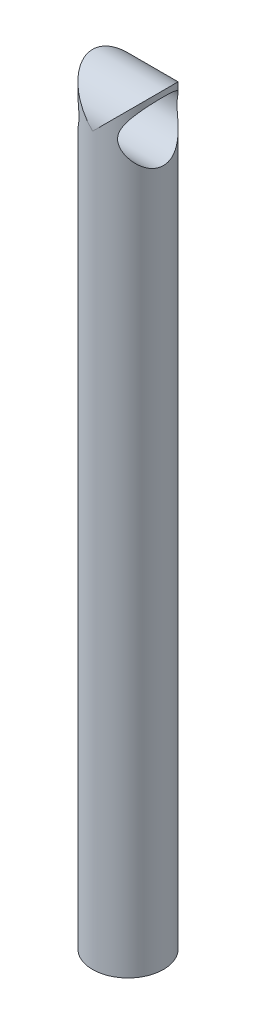
ISO-10303-21;
HEADER;
FILE_DESCRIPTION(('STEP AP214'),'2;1');
FILE_NAME('part.step','',(''),(''),'','','');
FILE_SCHEMA(('AUTOMOTIVE_DESIGN { 1 0 10303 214 1 1 1 1 }'));
ENDSEC;
DATA;
#1=APPLICATION_CONTEXT('core data for automotive mechanical design processes');
#2=APPLICATION_PROTOCOL_DEFINITION('international standard','automotive_design',2000,#1);
#3=PRODUCT_CONTEXT('',#1,'mechanical');
#4=PRODUCT('Part','Part','',(#3));
#5=PRODUCT_RELATED_PRODUCT_CATEGORY('part','',(#4));
#6=PRODUCT_DEFINITION_FORMATION('','',#4);
#7=PRODUCT_DEFINITION_CONTEXT('part definition',#1,'design');
#8=PRODUCT_DEFINITION('design','',#6,#7);
#9=PRODUCT_DEFINITION_SHAPE('','',#8);
#10=(LENGTH_UNIT() NAMED_UNIT(*) SI_UNIT(.MILLI.,.METRE.));
#11=(NAMED_UNIT(*) PLANE_ANGLE_UNIT() SI_UNIT($,.RADIAN.));
#12=(NAMED_UNIT(*) SI_UNIT($,.STERADIAN.) SOLID_ANGLE_UNIT());
#13=UNCERTAINTY_MEASURE_WITH_UNIT(LENGTH_MEASURE(1.E-05),#10,'distance_accuracy_value','');
#14=(GEOMETRIC_REPRESENTATION_CONTEXT(3) GLOBAL_UNCERTAINTY_ASSIGNED_CONTEXT((#13)) GLOBAL_UNIT_ASSIGNED_CONTEXT((#10,
#11,#12)) REPRESENTATION_CONTEXT('',''));
#15=CARTESIAN_POINT('',(0.,0.,0.));
#16=DIRECTION('',(0.,0.,1.));
#17=DIRECTION('',(1.,0.,0.));
#18=AXIS2_PLACEMENT_3D('',#15,#16,#17);
#19=CARTESIAN_POINT('',(0.,101.6,0.));
#20=DIRECTION('',(0.,-1.,0.));
#21=DIRECTION('',(0.,0.,-1.));
#22=AXIS2_PLACEMENT_3D('',#19,#20,#21);
#23=CYLINDRICAL_SURFACE('',#22,4.73075);
#24=CARTESIAN_POINT('',(-4.73075,92.9005,0.));
#25=CARTESIAN_POINT('',(-4.73074913033436,92.9005008863845,-0.0939806417282282));
#26=CARTESIAN_POINT('',(-4.72794287813442,92.9038447836133,-0.187979869598763));
#27=CARTESIAN_POINT('',(-4.71678018112427,92.9171608106088,-0.375215117248981));
#28=CARTESIAN_POINT('',(-4.70842059153266,92.9271366959849,-0.468450674269981));
#29=CARTESIAN_POINT('',(-4.68632011533821,92.9535597342124,-0.653524965714133));
#30=CARTESIAN_POINT('',(-4.67256978813208,92.9700182400796,-0.745360954400749));
#31=CARTESIAN_POINT('',(-4.63999379819718,93.00911551341,-0.9268058187853));
#32=CARTESIAN_POINT('',(-4.62116580027675,93.0317571245084,-1.01641364900489));
#33=CARTESIAN_POINT('',(-4.55792209872708,93.1080724581659,-1.27971882696562));
#34=CARTESIAN_POINT('',(-4.50656377584212,93.170352577718,-1.44935381563049));
#35=CARTESIAN_POINT('',(-4.38888344348945,93.3146720327283,-1.774153749356));
#36=CARTESIAN_POINT('',(-4.32256161465289,93.3967111296679,-1.92931886905693));
#37=CARTESIAN_POINT('',(-4.2013486954662,93.5490520829122,-2.17745257522755));
#38=CARTESIAN_POINT('',(-4.14941093080523,93.6149460844791,-2.27464811733148));
#39=CARTESIAN_POINT('',(-4.04142375060201,93.7538053507348,-2.46140609177837));
#40=CARTESIAN_POINT('',(-3.98537423189192,93.8267707928677,-2.55096833247254));
#41=CARTESIAN_POINT('',(-3.87015530380712,93.9793377553306,-2.72261091394219));
#42=CARTESIAN_POINT('',(-3.81097749434243,94.0589575151216,-2.80466930749562));
#43=CARTESIAN_POINT('',(-3.6908289015994,94.2241760261593,-2.96099483919658));
#44=CARTESIAN_POINT('',(-3.62985877660445,94.3097725977373,-3.03526479322461));
#45=CARTESIAN_POINT('',(-3.50617172894973,94.4883977517907,-3.17738793231428));
#46=CARTESIAN_POINT('',(-3.44344359142083,94.5815363765623,-3.24509297328402));
#47=CARTESIAN_POINT('',(-3.31883360890746,94.7737779172069,-3.3724284145958));
#48=CARTESIAN_POINT('',(-3.25695205379881,94.8728828162008,-3.43205610847668));
#49=CARTESIAN_POINT('',(-3.13600690927128,95.0769698915066,-3.54290324698783));
#50=CARTESIAN_POINT('',(-3.07693707954222,95.1819378096681,-3.59414199255155));
#51=CARTESIAN_POINT('',(-2.96386452900353,95.3982069106626,-3.68793862938186));
#52=CARTESIAN_POINT('',(-2.90985754779597,95.5095026395818,-3.73050385549113));
#53=CARTESIAN_POINT('',(-2.80577142518534,95.7485911582924,-3.80949580613738));
#54=CARTESIAN_POINT('',(-2.75641174940706,95.8769829246336,-3.8450979202401));
#55=CARTESIAN_POINT('',(-2.67272699039781,96.1412055145986,-3.9037364871325));
#56=CARTESIAN_POINT('',(-2.63836627395542,96.2770178350208,-3.9268027538172));
#57=CARTESIAN_POINT('',(-2.59002883217623,96.5559224510817,-3.95887215618646));
#58=CARTESIAN_POINT('',(-2.57631901400834,96.6990857436938,-3.96769125485689));
#59=CARTESIAN_POINT('',(-2.5733367994655,96.9857579299077,-3.96962738878156));
#60=CARTESIAN_POINT('',(-2.5840594258715,97.129266747172,-3.96274762210637));
#61=CARTESIAN_POINT('',(-2.62885959609538,97.4207481479719,-3.93316601533195));
#62=CARTESIAN_POINT('',(-2.66447356738763,97.5683621426431,-3.90942153128765));
#63=CARTESIAN_POINT('',(-2.75354785467926,97.8550358684024,-3.84719021312922));
#64=CARTESIAN_POINT('',(-2.80706851390373,97.9940647665764,-3.80865346544434));
#65=CARTESIAN_POINT('',(-2.9134262021807,98.2361348912517,-3.72766716569107));
#66=CARTESIAN_POINT('',(-2.96429996373065,98.3408508137363,-3.68750351966326));
#67=CARTESIAN_POINT('',(-3.07057911624298,98.5446619760648,-3.59948603443905));
#68=CARTESIAN_POINT('',(-3.12598725167142,98.6437537494822,-3.55162752070451));
#69=CARTESIAN_POINT('',(-3.2393838091879,98.8366538837284,-3.44851773025266));
#70=CARTESIAN_POINT('',(-3.29737567668693,98.9304547873182,-3.39325637217126));
#71=CARTESIAN_POINT('',(-3.41431357470089,99.1127747752907,-3.27556733556311));
#72=CARTESIAN_POINT('',(-3.4732594053006,99.2012949485545,-3.21314114223423));
#73=CARTESIAN_POINT('',(-3.59426079087802,99.3780498807517,-3.07734109522907));
#74=CARTESIAN_POINT('',(-3.65629870418733,99.4659711198334,-3.003542566101));
#75=CARTESIAN_POINT('',(-3.77874265976216,99.6357148811644,-2.8479651173399));
#76=CARTESIAN_POINT('',(-3.83914846210554,99.7175365098405,-2.76618503247123));
#77=CARTESIAN_POINT('',(-3.95699405009166,99.8744891030321,-2.594798483188));
#78=CARTESIAN_POINT('',(-4.01443937637671,99.9496327719546,-2.50520755122262));
#79=CARTESIAN_POINT('',(-4.12527953324713,100.092750787235,-2.31816868573206));
#80=CARTESIAN_POINT('',(-4.17867429167995,100.160725005893,-2.22072061231177));
#81=CARTESIAN_POINT('',(-4.30753363635934,100.323151122668,-1.96352295445991));
#82=CARTESIAN_POINT('',(-4.3794532947026,100.412221153464,-1.7984173002155));
#83=CARTESIAN_POINT('',(-4.47449846475505,100.528841994461,-1.53863747015299));
#84=CARTESIAN_POINT('',(-4.50404764026048,100.564892656867,-1.44999732716498));
#85=CARTESIAN_POINT('',(-4.55833506419148,100.63086583935,-1.26904698713778));
#86=CARTESIAN_POINT('',(-4.58307536892576,100.660790979038,-1.17673837918947));
#87=CARTESIAN_POINT('',(-4.62741723523714,100.714272254379,-0.988165543245692));
#88=CARTESIAN_POINT('',(-4.64697192556483,100.737770353939,-0.891873765464703));
#89=CARTESIAN_POINT('',(-4.68018702109579,100.777606783827,-0.696864173858378));
#90=CARTESIAN_POINT('',(-4.69385042606728,100.79394875803,-0.598147621827935));
#91=CARTESIAN_POINT('',(-4.71494351766432,100.819151388563,-0.399138093000496));
#92=CARTESIAN_POINT('',(-4.72237552559209,100.828014830782,-0.298845717420976));
#93=CARTESIAN_POINT('',(-4.7308144997927,100.838077846444,-0.0976143618227979));
#94=CARTESIAN_POINT('',(-4.73182225893961,100.839278365636,0.00332453686333426));
#95=CARTESIAN_POINT('',(-4.7276708100602,100.834329272163,0.191967540956982));
#96=CARTESIAN_POINT('',(-4.72328331316591,100.829099436954,0.279714365388668));
#97=CARTESIAN_POINT('',(-4.70970102070865,100.812888238879,0.454307988989981));
#98=CARTESIAN_POINT('',(-4.70050473338932,100.80190509125,0.541154500338795));
#99=CARTESIAN_POINT('',(-4.66594918229937,100.760561551337,0.799348444922782));
#100=CARTESIAN_POINT('',(-4.63361887820536,100.721802010521,0.968525440249296));
#101=CARTESIAN_POINT('',(-4.5525997068109,100.623966611222,1.29716896922015));
#102=CARTESIAN_POINT('',(-4.50386021712379,100.564827869381,1.45660362709089));
#103=CARTESIAN_POINT('',(-4.39308397267465,100.428983282284,1.76276997148691));
#104=CARTESIAN_POINT('',(-4.33104198081048,100.35227051744,1.90949662292557));
#105=CARTESIAN_POINT('',(-4.16678719066342,100.1462289265,2.25122341381291));
#106=CARTESIAN_POINT('',(-4.05898522042404,100.00867800941,2.43864439663669));
#107=CARTESIAN_POINT('',(-3.88819250920595,99.7832514491616,2.6967974821068));
#108=CARTESIAN_POINT('',(-3.82962699527536,99.7047589319411,2.77915289368898));
#109=CARTESIAN_POINT('',(-3.71058004040893,99.5417939120569,2.9362001252443));
#110=CARTESIAN_POINT('',(-3.65009931532347,99.4573236294658,3.01089476535769));
#111=CARTESIAN_POINT('',(-3.52730686903073,99.2810848703623,3.15391065314387));
#112=CARTESIAN_POINT('',(-3.46498189838005,99.189211087879,3.22209017252661));
#113=CARTESIAN_POINT('',(-3.34098440123215,98.9995811803161,3.3504896086023));
#114=CARTESIAN_POINT('',(-3.27931208176763,98.901823250778,3.41070706532978));
#115=CARTESIAN_POINT('',(-3.15849385730745,98.7005180108776,3.52288053377794));
#116=CARTESIAN_POINT('',(-3.09934287068374,98.5969834210618,3.57485379905192));
#117=CARTESIAN_POINT('',(-2.98570381331455,98.3836944169856,3.67029555367076));
#118=CARTESIAN_POINT('',(-2.93121218191423,98.2739448607437,3.71377057060839));
#119=CARTESIAN_POINT('',(-2.82443436210786,98.0358412430594,3.79572725671029));
#120=CARTESIAN_POINT('',(-2.77299048501176,97.9067469915138,3.83319500305309));
#121=CARTESIAN_POINT('',(-2.68487401692861,97.6406780129303,3.89543340782833));
#122=CARTESIAN_POINT('',(-2.64816872964845,97.5037215083912,3.9202322049128));
#123=CARTESIAN_POINT('',(-2.60839532413988,97.2930307859034,3.94670989499622));
#124=CARTESIAN_POINT('',(-2.59766387968023,97.2213759058833,3.95376029841831));
#125=CARTESIAN_POINT('',(-2.58207813902328,97.0771699601514,3.96395748445331));
#126=CARTESIAN_POINT('',(-2.57722072619139,97.0046193903348,3.9671063371668));
#127=CARTESIAN_POINT('',(-2.57368313070753,96.8593180193239,3.9694024486088));
#128=CARTESIAN_POINT('',(-2.57500155880934,96.7865672668399,3.96855060728736));
#129=CARTESIAN_POINT('',(-2.58371724676678,96.6416043629612,3.96288069814061));
#130=CARTESIAN_POINT('',(-2.59111451133444,96.569392211984,3.95806262724086));
#131=CARTESIAN_POINT('',(-2.61886001932239,96.3752248633803,3.93980036752592));
#132=CARTESIAN_POINT('',(-2.64467524313614,96.2543703769674,3.92265988008436));
#133=CARTESIAN_POINT('',(-2.70931406988473,96.0181398935167,3.87828753527016));
#134=CARTESIAN_POINT('',(-2.74815703232052,95.9027723432375,3.85104065315644));
#135=CARTESIAN_POINT('',(-2.83085990281408,95.6887646887073,3.79059380958591));
#136=CARTESIAN_POINT('',(-2.873903855159,95.5895720547835,3.75819522162329));
#137=CARTESIAN_POINT('',(-2.9651344182132,95.3960581772344,3.68664287633197));
#138=CARTESIAN_POINT('',(-3.01332481812868,95.3017405998797,3.64748412839807));
#139=CARTESIAN_POINT('',(-3.11308628192834,95.117597309432,3.56272178547598));
#140=CARTESIAN_POINT('',(-3.16466527749709,95.0277830704412,3.51710275829169));
#141=CARTESIAN_POINT('',(-3.26964144661388,94.8527087622566,3.41973219957371));
#142=CARTESIAN_POINT('',(-3.32303819594202,94.7674476422447,3.36798209198849));
#143=CARTESIAN_POINT('',(-3.43411060706229,94.5957807052395,3.25477777424823));
#144=CARTESIAN_POINT('',(-3.49183351077499,94.5096800263652,3.19290593967204));
#145=CARTESIAN_POINT('',(-3.6068913310195,94.3425311601289,3.06233889036253));
#146=CARTESIAN_POINT('',(-3.66422611426236,94.2614846370768,2.99364144709862));
#147=CARTESIAN_POINT('',(-3.83391188035728,94.0264185479898,2.7775096392515));
#148=CARTESIAN_POINT('',(-3.94420660636059,93.8800804652583,2.61977808739477));
#149=CARTESIAN_POINT('',(-4.14025431160986,93.6260413263665,2.29570016257488));
#150=CARTESIAN_POINT('',(-4.22737117951806,93.5158757169049,2.13211576097762));
#151=CARTESIAN_POINT('',(-4.38549397302701,93.3186131211205,1.78432857327485));
#152=CARTESIAN_POINT('',(-4.4565096017334,93.2315022359824,1.60013830539545));
#153=CARTESIAN_POINT('',(-4.56730191083962,93.0966573938623,1.24447714122916));
#154=CARTESIAN_POINT('',(-4.61023304285881,93.0448879160606,1.07555143410895));
#155=CARTESIAN_POINT('',(-4.66071325940669,92.9842341510531,0.81581411318288));
#156=CARTESIAN_POINT('',(-4.6752151779483,92.966856001646,0.728241742836209));
#157=CARTESIAN_POINT('',(-4.69933994253559,92.9379853572701,0.551484228726198));
#158=CARTESIAN_POINT('',(-4.70896523678044,92.9264899089949,0.462299917538495));
#159=CARTESIAN_POINT('',(-4.720934048177,92.9122045654704,0.310847577621852));
#160=CARTESIAN_POINT('',(-4.72461088726033,92.9078195060855,0.24882704485749));
#161=CARTESIAN_POINT('',(-4.72951937330792,92.9019666648135,0.124540423333824));
#162=CARTESIAN_POINT('',(-4.73075057626561,92.9004994126559,0.06227429204163));
#163=CARTESIAN_POINT('',(-4.73075,92.9005,0.));
#164=B_SPLINE_CURVE_WITH_KNOTS('',3,(#24,#25,#26,#27,#28,#29,#30,#31,#32,#33,#34,#35,#36,#37,
#38,#39,#40,#41,#42,#43,#44,#45,#46,#47,#48,#49,#50,#51,#52,#53,#54,#55,#56,#57,#58,#59,#60,#61,
#62,#63,#64,#65,#66,#67,#68,#69,#70,#71,#72,#73,#74,#75,#76,#77,#78,#79,#80,#81,#82,#83,#84,#85,
#86,#87,#88,#89,#90,#91,#92,#93,#94,#95,#96,#97,#98,#99,#100,#101,#102,#103,#104,#105,#106,#107,
#108,#109,#110,#111,#112,#113,#114,#115,#116,#117,#118,#119,#120,#121,#122,#123,#124,#125,#126,
#127,#128,#129,#130,#131,#132,#133,#134,#135,#136,#137,#138,#139,#140,#141,#142,#143,#144,#145,
#146,#147,#148,#149,#150,#151,#152,#153,#154,#155,#156,#157,#158,#159,#160,#161,#162,#163),
.UNSPECIFIED.,.T.,.F.,(4,2,2,2,2,2,2,2,2,2,2,2,2,2,2,2,2,2,2,2,2,2,2,2,2,2,2,2,2,2,2,2,2,2,2,2,
2,2,2,2,2,2,2,2,2,2,2,2,2,2,2,2,2,2,2,2,2,2,2,2,2,2,2,2,2,2,2,2,2,4),(0.,0.281873322431279,
0.563906402214502,0.846435618608609,1.12909499079978,1.69002325054259,2.25094473943215,
2.6356717360245,3.02040838908818,3.40623655082735,3.79192473341691,4.18491651727929,
4.57803965614426,4.97024520184725,5.36211768607402,5.78716158685338,6.21119013583784,
6.64065347730734,7.07002933911383,7.52856108241537,7.98865384839474,8.35763922160206,
8.72684960177356,9.09656799185502,9.46620988100121,9.85726239953839,10.2483720938815,
10.6387210431397,11.0290769440325,11.6290432554591,11.9291953259253,12.2292187654213,
12.5318681136457,12.8343631741259,13.1367454998828,13.4390905052066,13.7027941664612,
13.9665796809803,14.4936317052402,15.0223248170914,15.5512264551674,16.3155234609104,
16.6991284959429,17.0825918047,17.4730758905267,17.8636803401276,18.2534562237642,
18.6429315297905,19.0735854068405,19.5032785659135,19.721367880406,19.939341430567,
20.1572659502575,20.3751906388728,20.7479084011985,21.12118250243,21.4593341125692,
21.7977364349319,22.1369612072934,22.4761073483013,22.8379464244758,23.1999040301403,
23.9222207411821,24.5666662789671,25.2107224155004,25.7536328419216,26.0247007884,
26.2956325161548,26.482376033821,26.6691534517768),.UNSPECIFIED.);
#165=CARTESIAN_POINT('',(-4.73075,92.9005,0.));
#166=VERTEX_POINT('',#165);
#167=EDGE_CURVE('E12',#166,#166,#164,.T.);
#168=ORIENTED_EDGE('',*,*,#167,.T.);
#169=EDGE_LOOP('',(#168));
#170=FACE_BOUND('',#169,.T.);
#171=CARTESIAN_POINT('',(2.57468813645456,96.86925,-3.96875000000002));
#172=CARTESIAN_POINT('',(2.57468971332988,96.7998980081788,-3.96874942252867));
#173=CARTESIAN_POINT('',(2.57750730844369,96.730529941634,-3.96692601158753));
#174=CARTESIAN_POINT('',(2.58861018303855,96.5924054526715,-3.95968816621984));
#175=CARTESIAN_POINT('',(2.59689877167568,96.5236494259738,-3.95427155842139));
#176=CARTESIAN_POINT('',(2.62942371788314,96.3188314522111,-3.93278997364381));
#177=CARTESIAN_POINT('',(2.66131672407075,96.184489454451,-3.91149402252363));
#178=CARTESIAN_POINT('',(2.75570115172024,95.8715742086283,-3.84583712088785));
#179=CARTESIAN_POINT('',(2.82530243131441,95.6964856370514,-3.79568866945638));
#180=CARTESIAN_POINT('',(2.98035012531045,95.3606851851139,-3.67521360901828));
#181=CARTESIAN_POINT('',(3.0658491984775,95.2000237943852,-3.60481950319504));
#182=CARTESIAN_POINT('',(3.21978521105142,94.9337097822779,-3.46708048205796));
#183=CARTESIAN_POINT('',(3.28663430019573,94.8248753987365,-3.40399800638964));
#184=CARTESIAN_POINT('',(3.42167551477274,94.6141659636423,-3.26822513815505));
#185=CARTESIAN_POINT('',(3.48986822354118,94.5122940246204,-3.19553049057666));
#186=CARTESIAN_POINT('',(3.62554279322453,94.3157072247998,-3.04072706614033));
#187=CARTESIAN_POINT('',(3.69302540682988,94.220983949093,-2.95862965362112));
#188=CARTESIAN_POINT('',(3.82569960997006,94.0389076623435,-2.78495427775518));
#189=CARTESIAN_POINT('',(3.89089095391633,93.9515554399661,-2.6933753022578));
#190=CARTESIAN_POINT('',(4.05349649647094,93.7373003611188,-2.44578610524948));
#191=CARTESIAN_POINT('',(4.14812701200515,93.6161916559812,-2.28277565363195));
#192=CARTESIAN_POINT('',(4.32164710374793,93.3976523923946,-1.93420300412107));
#193=CARTESIAN_POINT('',(4.40056226908314,93.300183284513,-1.7486782721724));
#194=CARTESIAN_POINT('',(4.52458749478743,93.1484403705266,-1.39186153676563));
#195=CARTESIAN_POINT('',(4.57319506489266,93.0895947359095,-1.22374738539485));
#196=CARTESIAN_POINT('',(4.65211877327304,92.9944726000649,-0.877101709358034));
#197=CARTESIAN_POINT('',(4.68244552296854,92.9581830054099,-0.698576294229431));
#198=CARTESIAN_POINT('',(4.72241952763671,92.9104116175586,-0.335104521582745));
#199=CARTESIAN_POINT('',(4.73197750858056,92.8990369187396,-0.150133903620625));
#200=CARTESIAN_POINT('',(4.7292688074294,92.9022654742893,0.219418813555246));
#201=CARTESIAN_POINT('',(4.71700302474351,92.916867658089,0.404000928466256));
#202=CARTESIAN_POINT('',(4.67335567862698,92.9690682572084,0.754143049894952));
#203=CARTESIAN_POINT('',(4.64335965621404,93.0050006097326,0.920134230873089));
#204=CARTESIAN_POINT('',(4.56759452754372,93.0963794504058,1.2428048069838));
#205=CARTESIAN_POINT('',(4.52182308957218,93.1518288233293,1.39948282155065));
#206=CARTESIAN_POINT('',(4.41288381129009,93.2851013934502,1.71358251663821));
#207=CARTESIAN_POINT('',(4.34858225732613,93.364406526137,1.86997325887044));
#208=CARTESIAN_POINT('',(4.20832681426931,93.5400158569463,2.16726458994665));
#209=CARTESIAN_POINT('',(4.13236290272485,93.6363346872021,2.30815167468175));
#210=CARTESIAN_POINT('',(3.99308695696243,93.8166937647426,2.53938733554128));
#211=CARTESIAN_POINT('',(3.93156458153492,93.8974942115299,2.63339902419367));
#212=CARTESIAN_POINT('',(3.80552439042024,94.0663655606926,2.81246513959541));
#213=CARTESIAN_POINT('',(3.74100645082976,94.1544367639204,2.89751919536035));
#214=CARTESIAN_POINT('',(3.6103233034091,94.3375431335717,3.0588163510431));
#215=CARTESIAN_POINT('',(3.54415513342799,94.4325915225748,3.13504197691412));
#216=CARTESIAN_POINT('',(3.41191367327337,94.6292839224181,3.27846634721927));
#217=CARTESIAN_POINT('',(3.34584035808786,94.7309256255107,3.34566822507064));
#218=CARTESIAN_POINT('',(3.23231050629417,94.9141110730157,3.45495234870604));
#219=CARTESIAN_POINT('',(3.18440415243185,94.9941683481571,3.4990696647865));
#220=CARTESIAN_POINT('',(3.09070679702221,95.1581161783386,3.58210007111587));
#221=CARTESIAN_POINT('',(3.044915289496,95.2420058068303,3.62101441044812));
#222=CARTESIAN_POINT('',(2.95676420764239,95.4136252668607,3.69334307909609));
#223=CARTESIAN_POINT('',(2.91439732260267,95.5013462672593,3.72676929054642));
#224=CARTESIAN_POINT('',(2.83456369118889,95.6808914742188,3.78784510516927));
#225=CARTESIAN_POINT('',(2.79709443202997,95.772713543974,3.81549767496189));
#226=CARTESIAN_POINT('',(2.71816820067168,95.9902354169676,3.87228713877421));
#227=CARTESIAN_POINT('',(2.67918460623704,96.1174814471978,3.89913832994346));
#228=CARTESIAN_POINT('',(2.61814368106644,96.3777922860715,3.94039577931789));
#229=CARTESIAN_POINT('',(2.59604535032595,96.5108421654813,3.95483219327597));
#230=CARTESIAN_POINT('',(2.57268925163198,96.7807338424435,3.97007572412585));
#231=CARTESIAN_POINT('',(2.5715977075302,96.9175973087811,3.97077413502207));
#232=CARTESIAN_POINT('',(2.59093195265002,97.1891916197987,3.95817722511464));
#233=CARTESIAN_POINT('',(2.61138555676877,97.3239194792052,3.94486381499715));
#234=CARTESIAN_POINT('',(2.67675095352269,97.6184371918344,3.90087649847682));
#235=CARTESIAN_POINT('',(2.7262914728127,97.7766488455074,3.86685017734677));
#236=CARTESIAN_POINT('',(2.84251097363806,98.0821072638961,3.78222958950237));
#237=CARTESIAN_POINT('',(2.90924742108077,98.2293150854128,3.73157961086454));
#238=CARTESIAN_POINT('',(3.03766701431323,98.4841409154006,3.62739565117231));
#239=CARTESIAN_POINT('',(3.09764529607703,98.5937471128253,3.57651364227216));
#240=CARTESIAN_POINT('',(3.22093516159023,98.8064987810704,3.46589526925919));
#241=CARTESIAN_POINT('',(3.28424854864365,98.909640689239,3.4061540826017));
#242=CARTESIAN_POINT('',(3.41217318588719,99.1097456704636,3.2780001822434));
#243=CARTESIAN_POINT('',(3.4767859362225,99.2067009899851,3.20957689622827));
#244=CARTESIAN_POINT('',(3.60556613667961,99.3942711061045,3.06419958740271));
#245=CARTESIAN_POINT('',(3.6697336737017,99.4848871733111,2.98724728214449));
#246=CARTESIAN_POINT('',(3.79813673076087,99.6622185203343,2.82230552577005));
#247=CARTESIAN_POINT('',(3.86231421417688,99.7487295060547,2.73405033897716));
#248=CARTESIAN_POINT('',(3.98722410662835,99.9142262366308,2.54844248198938));
#249=CARTESIAN_POINT('',(4.04795586798694,99.9932105686187,2.45108811050603));
#250=CARTESIAN_POINT('',(4.16434188249123,100.142613744726,2.24765087824655));
#251=CARTESIAN_POINT('',(4.22000974949859,100.213055735186,2.14159297199877));
#252=CARTESIAN_POINT('',(4.32492650808844,100.344524822402,1.92092429908782));
#253=CARTESIAN_POINT('',(4.37417907934502,100.40555731996,1.80631849517026));
#254=CARTESIAN_POINT('',(4.48036596438688,100.536207402101,1.52817610658007));
#255=CARTESIAN_POINT('',(4.53414094904918,100.601589704114,1.36133912550186));
#256=CARTESIAN_POINT('',(4.60135213987211,100.682863282505,1.10251882689573));
#257=CARTESIAN_POINT('',(4.6215165429754,100.707157516633,1.0148004320513));
#258=CARTESIAN_POINT('',(4.65699984242301,100.749813207031,0.836986800060565));
#259=CARTESIAN_POINT('',(4.67232097323532,100.76817739924,0.746892679813652));
#260=CARTESIAN_POINT('',(4.69786976563126,100.798757851856,0.564407471083052));
#261=CARTESIAN_POINT('',(4.7080674485377,100.810937931635,0.472006109696493));
#262=CARTESIAN_POINT('',(4.72300603097101,100.828768999958,0.286172811117981));
#263=CARTESIAN_POINT('',(4.72774917195933,100.834422670434,0.192741313191811));
#264=CARTESIAN_POINT('',(4.73167209694337,100.839099367499,0.00558041267831398));
#265=CARTESIAN_POINT('',(4.73085133622483,100.838121744873,-0.0881490181792048));
#266=CARTESIAN_POINT('',(4.72367446612405,100.829563720702,-0.2750645566001));
#267=CARTESIAN_POINT('',(4.71731863037997,100.821983645562,-0.368250690793239));
#268=CARTESIAN_POINT('',(4.69158924111414,100.79125502068,-0.630956035453827));
#269=CARTESIAN_POINT('',(4.66577114825943,100.76038431477,-0.79903533825991));
#270=CARTESIAN_POINT('',(4.59770681543591,100.678501908132,-1.12657061753848));
#271=CARTESIAN_POINT('',(4.55545793527302,100.627486970493,-1.28602520344866));
#272=CARTESIAN_POINT('',(4.45406854022418,100.503948603216,-1.60335538048102));
#273=CARTESIAN_POINT('',(4.39402372965734,100.430262435712,-1.76048388316216));
#274=CARTESIAN_POINT('',(4.2618276737827,100.265800896931,-2.06001592499098));
#275=CARTESIAN_POINT('',(4.1896682241492,100.17501393947,-2.20240937886156));
#276=CARTESIAN_POINT('',(4.05656531879166,100.004336058167,-2.43668647911135));
#277=CARTESIAN_POINT('',(3.9975544324789,99.9277089758899,-2.53210294973308));
#278=CARTESIAN_POINT('',(3.87614443774756,99.7672209867215,-2.71430995348108));
#279=CARTESIAN_POINT('',(3.81374521085067,99.6833598268197,-2.8011001846775));
#280=CARTESIAN_POINT('',(3.68678178873654,99.5087471729361,-2.96622823046802));
#281=CARTESIAN_POINT('',(3.62221279147425,99.4179797449925,-3.04454542305172));
#282=CARTESIAN_POINT('',(3.49251904924541,99.230034809106,-3.19248697176129));
#283=CARTESIAN_POINT('',(3.42739446114109,99.1328590614957,-3.26211370003651));
#284=CARTESIAN_POINT('',(3.3097331935683,98.9499477582531,-3.38102996837489));
#285=CARTESIAN_POINT('',(3.25701519075633,98.8652458361866,-3.43173518303409));
#286=CARTESIAN_POINT('',(3.1534578062155,98.6913804115939,-3.5271309751527));
#287=CARTESIAN_POINT('',(3.10261872652666,98.6022161971234,-3.57182058861874));
#288=CARTESIAN_POINT('',(3.00436184656126,98.4194432164146,-3.65485019162538));
#289=CARTESIAN_POINT('',(2.95693649788121,98.3258450657759,-3.69320444944223));
#290=CARTESIAN_POINT('',(2.8672422464047,98.1338646010972,-3.76326416583868));
#291=CARTESIAN_POINT('',(2.82496995312562,98.0354854929754,-3.79497400613469));
#292=CARTESIAN_POINT('',(2.73775182197482,97.8073909028534,-3.85853886180135));
#293=CARTESIAN_POINT('',(2.69499439950884,97.6762051084718,-3.88826609549778));
#294=CARTESIAN_POINT('',(2.62713620861666,97.4072856323486,-3.93445129982635));
#295=CARTESIAN_POINT('',(2.6019665795642,97.2695797670061,-3.95096105763827));
#296=CARTESIAN_POINT('',(2.58352187490537,97.087101590435,-3.96300686982783));
#297=CARTESIAN_POINT('',(2.58021904740938,97.0436366512387,-3.96515688608246));
#298=CARTESIAN_POINT('',(2.57580142975832,96.9565332885993,-3.96802879751452));
#299=CARTESIAN_POINT('',(2.5746871440901,96.9128948274797,-3.96875036341622));
#300=CARTESIAN_POINT('',(2.57468813645456,96.86925,-3.96875000000002));
#301=B_SPLINE_CURVE_WITH_KNOTS('',3,(#171,#172,#173,#174,#175,#176,#177,#178,#179,#180,#181,
#182,#183,#184,#185,#186,#187,#188,#189,#190,#191,#192,#193,#194,#195,#196,#197,#198,#199,#200,
#201,#202,#203,#204,#205,#206,#207,#208,#209,#210,#211,#212,#213,#214,#215,#216,#217,#218,#219,
#220,#221,#222,#223,#224,#225,#226,#227,#228,#229,#230,#231,#232,#233,#234,#235,#236,#237,#238,
#239,#240,#241,#242,#243,#244,#245,#246,#247,#248,#249,#250,#251,#252,#253,#254,#255,#256,#257,
#258,#259,#260,#261,#262,#263,#264,#265,#266,#267,#268,#269,#270,#271,#272,#273,#274,#275,#276,
#277,#278,#279,#280,#281,#282,#283,#284,#285,#286,#287,#288,#289,#290,#291,#292,#293,#294,#295,
#296,#297,#298,#299,#300),.UNSPECIFIED.,.T.,.F.,(4,2,2,2,2,2,2,2,2,2,2,2,2,2,2,2,2,2,2,2,2,2,2,
2,2,2,2,2,2,2,2,2,2,2,2,2,2,2,2,2,2,2,2,2,2,2,2,2,2,2,2,2,2,2,2,2,2,2,2,2,2,2,2,2,4),(0.,
0.20800108943598,0.416128104735451,0.833179099702599,1.41493363412342,1.99865061532342,
2.42553418063583,2.85260735075544,3.27916969430397,3.70577762014526,4.37524812967868,
5.04361947087042,5.59519888597141,6.14645781811185,6.70008167370928,7.25368271368132,
7.76886837787224,8.28413022270254,8.84242932267758,9.40121093021207,9.81588202140292,
10.2305702796357,10.646065785859,11.0614166397447,11.3708242817282,11.6801575100527,
11.9888119201029,12.2973073445196,12.7031613501032,13.1080267205839,13.5160944299718,
13.9246896032877,14.4295967582683,14.9362136207058,15.3404356938635,15.7448786209124,
16.1498188570734,16.554677695055,16.9719286736184,17.389257822896,17.8054296365707,
18.2213616820042,18.7799528592299,19.0593547017258,19.3386274520129,19.619515806674,
19.9002886932238,20.181089068254,20.4618755621107,20.9778472245068,21.4939018304976,
22.0428170725804,22.5921055640089,22.9991916821126,23.4062920437582,23.8143619307932,
24.2223201863298,24.5578194421922,24.8933723975925,25.228159011986,25.5627241488552,
25.9847242162102,26.4050626471401,26.5359324249045,26.6668323662852),.UNSPECIFIED.);
#302=CARTESIAN_POINT('',(2.57468813645456,96.86925,-3.96875000000002));
#303=VERTEX_POINT('',#302);
#304=EDGE_CURVE('E98',#303,#303,#301,.T.);
#305=ORIENTED_EDGE('',*,*,#304,.T.);
#306=EDGE_LOOP('',(#305));
#307=FACE_BOUND('',#306,.T.);
#308=CARTESIAN_POINT('',(0.,0.,0.));
#309=DIRECTION('',(0.,1.,0.));
#310=DIRECTION('',(0.,0.,1.));
#311=AXIS2_PLACEMENT_3D('',#308,#309,#310);
#312=CIRCLE('',#311,4.73075);
#313=CARTESIAN_POINT('',(0.,0.,4.73075));
#314=VERTEX_POINT('',#313);
#315=EDGE_CURVE('E112',#314,#314,#312,.T.);
#316=ORIENTED_EDGE('',*,*,#315,.T.);
#317=EDGE_LOOP('',(#316));
#318=FACE_BOUND('',#317,.T.);
#319=CARTESIAN_POINT('',(0.,96.86925,0.));
#320=DIRECTION('',(-0.707106781186547,-0.707106781186547,0.));
#321=DIRECTION('',(0.707106781186547,-0.707106781186547,0.));
#322=AXIS2_PLACEMENT_3D('',#319,#320,#321);
#323=ELLIPSE('',#322,6.69029081019652,4.73075);
#324=CARTESIAN_POINT('',(0.,96.86925,-4.73075));
#325=VERTEX_POINT('',#324);
#326=CARTESIAN_POINT('',(0.,96.86925,4.73075));
#327=VERTEX_POINT('',#326);
#328=EDGE_CURVE('E104',#325,#327,#323,.F.);
#329=ORIENTED_EDGE('',*,*,#328,.F.);
#330=CARTESIAN_POINT('',(0.,96.86925,0.));
#331=DIRECTION('',(0.707106781186547,-0.707106781186547,0.));
#332=DIRECTION('',(-0.707106781186547,-0.707106781186547,0.));
#333=AXIS2_PLACEMENT_3D('',#330,#331,#332);
#334=ELLIPSE('',#333,6.69029081019652,4.73075);
#335=EDGE_CURVE('E107',#327,#325,#334,.F.);
#336=ORIENTED_EDGE('',*,*,#335,.F.);
#337=EDGE_LOOP('',(#329,#336));
#338=FACE_BOUND('',#337,.T.);
#339=ADVANCED_FACE('F85',(#170,#307,#318,#338),#23,.T.);
#340=CARTESIAN_POINT('',(0.,0.,0.));
#341=DIRECTION('',(0.,1.,0.));
#342=DIRECTION('',(0.,0.,1.));
#343=AXIS2_PLACEMENT_3D('',#340,#341,#342);
#344=PLANE('',#343);
#345=ORIENTED_EDGE('',*,*,#315,.F.);
#346=EDGE_LOOP('',(#345));
#347=FACE_BOUND('',#346,.T.);
#348=ADVANCED_FACE('F127',(#347),#344,.F.);
#349=CARTESIAN_POINT('',(-4.73075,96.86925,0.));
#350=DIRECTION('',(1.,0.,0.));
#351=DIRECTION('',(0.,0.,-1.));
#352=AXIS2_PLACEMENT_3D('',#349,#350,#351);
#353=CYLINDRICAL_SURFACE('',#352,4.73075);
#354=ORIENTED_EDGE('',*,*,#335,.T.);
#355=ORIENTED_EDGE('',*,*,#328,.T.);
#356=EDGE_LOOP('',(#354,#355));
#357=FACE_BOUND('',#356,.T.);
#358=ADVANCED_FACE('F110',(#357),#353,.T.);
#359=CARTESIAN_POINT('',(-4.73075,96.86925,0.));
#360=DIRECTION('',(1.,0.,0.));
#361=DIRECTION('',(0.,0.,-1.));
#362=AXIS2_PLACEMENT_3D('',#359,#360,#361);
#363=CYLINDRICAL_SURFACE('',#362,3.96875000000002);
#364=ORIENTED_EDGE('',*,*,#304,.F.);
#365=EDGE_LOOP('',(#364));
#366=FACE_BOUND('',#365,.T.);
#367=ORIENTED_EDGE('',*,*,#167,.F.);
#368=EDGE_LOOP('',(#367));
#369=FACE_BOUND('',#368,.T.);
#370=ADVANCED_FACE('F122',(#366,#369),#363,.F.);
#371=CLOSED_SHELL('',(#339,#348,#358,#370));
#372=MANIFOLD_SOLID_BREP('B2',#371);
#373=ADVANCED_BREP_SHAPE_REPRESENTATION('',(#18,#372),#14);
#374=SHAPE_DEFINITION_REPRESENTATION(#9,#373);
ENDSEC;
END-ISO-10303-21;
